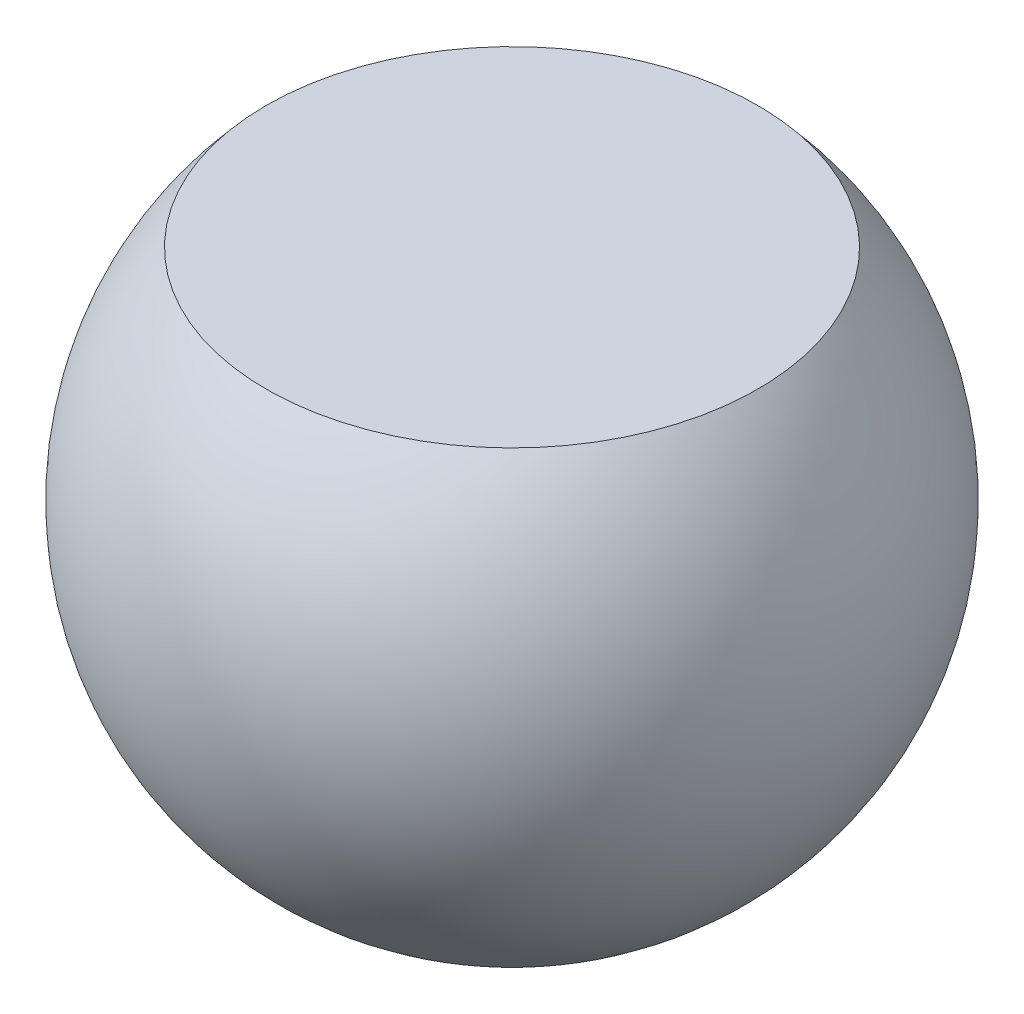
ISO-10303-21;
HEADER;
FILE_DESCRIPTION(('STEP AP214'),'2;1');
FILE_NAME('part.step','',(''),(''),'','','');
FILE_SCHEMA(('AUTOMOTIVE_DESIGN { 1 0 10303 214 1 1 1 1 }'));
ENDSEC;
DATA;
#1=APPLICATION_CONTEXT('core data for automotive mechanical design processes');
#2=APPLICATION_PROTOCOL_DEFINITION('international standard','automotive_design',2000,#1);
#3=PRODUCT_CONTEXT('',#1,'mechanical');
#4=PRODUCT('Part','Part','',(#3));
#5=PRODUCT_RELATED_PRODUCT_CATEGORY('part','',(#4));
#6=PRODUCT_DEFINITION_FORMATION('','',#4);
#7=PRODUCT_DEFINITION_CONTEXT('part definition',#1,'design');
#8=PRODUCT_DEFINITION('design','',#6,#7);
#9=PRODUCT_DEFINITION_SHAPE('','',#8);
#10=(LENGTH_UNIT() NAMED_UNIT(*) SI_UNIT(.MILLI.,.METRE.));
#11=(NAMED_UNIT(*) PLANE_ANGLE_UNIT() SI_UNIT($,.RADIAN.));
#12=(NAMED_UNIT(*) SI_UNIT($,.STERADIAN.) SOLID_ANGLE_UNIT());
#13=UNCERTAINTY_MEASURE_WITH_UNIT(LENGTH_MEASURE(1.E-05),#10,'distance_accuracy_value','');
#14=(GEOMETRIC_REPRESENTATION_CONTEXT(3) GLOBAL_UNCERTAINTY_ASSIGNED_CONTEXT((#13)) GLOBAL_UNIT_ASSIGNED_CONTEXT((#10,
#11,#12)) REPRESENTATION_CONTEXT('',''));
#15=CARTESIAN_POINT('',(0.,0.,0.));
#16=DIRECTION('',(0.,0.,1.));
#17=DIRECTION('',(1.,0.,0.));
#18=AXIS2_PLACEMENT_3D('',#15,#16,#17);
#19=CARTESIAN_POINT('',(0.,0.,0.));
#20=DIRECTION('',(0.,1.,0.));
#21=DIRECTION('',(-1.,0.,0.));
#22=AXIS2_PLACEMENT_3D('',#19,#20,#21);
#23=SPHERICAL_SURFACE('',#22,9.);
#24=CARTESIAN_POINT('',(0.,6.,0.));
#25=DIRECTION('',(0.,1.,0.));
#26=DIRECTION('',(-1.,0.,0.));
#27=AXIS2_PLACEMENT_3D('',#24,#25,#26);
#28=CIRCLE('',#27,6.70820393249937);
#29=CARTESIAN_POINT('',(-6.70820393249937,6.,0.));
#30=VERTEX_POINT('',#29);
#31=EDGE_CURVE('E10',#30,#30,#28,.T.);
#32=ORIENTED_EDGE('',*,*,#31,.F.);
#33=EDGE_LOOP('',(#32));
#34=FACE_BOUND('',#33,.T.);
#35=ADVANCED_FACE('F34',(#34),#23,.T.);
#36=CARTESIAN_POINT('',(0.,6.,0.));
#37=DIRECTION('',(0.,-1.,0.));
#38=DIRECTION('',(1.,0.,0.));
#39=AXIS2_PLACEMENT_3D('',#36,#37,#38);
#40=PLANE('',#39);
#41=ORIENTED_EDGE('',*,*,#31,.T.);
#42=EDGE_LOOP('',(#41));
#43=FACE_BOUND('',#42,.T.);
#44=ADVANCED_FACE('F41',(#43),#40,.F.);
#45=CLOSED_SHELL('',(#35,#44));
#46=MANIFOLD_SOLID_BREP('B2',#45);
#47=ADVANCED_BREP_SHAPE_REPRESENTATION('',(#18,#46),#14);
#48=SHAPE_DEFINITION_REPRESENTATION(#9,#47);
ENDSEC;
END-ISO-10303-21;
